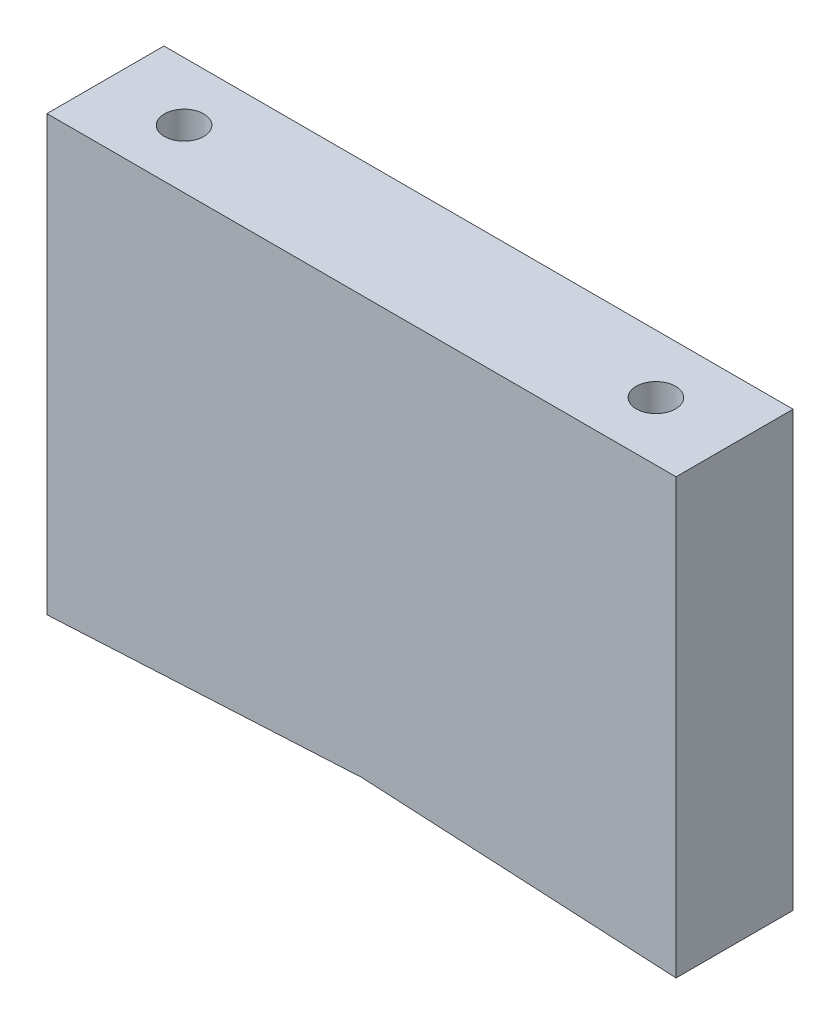
ISO-10303-21;
HEADER;
FILE_DESCRIPTION(('STEP AP214'),'2;1');
FILE_NAME('part.step','',(''),(''),'','','');
FILE_SCHEMA(('AUTOMOTIVE_DESIGN { 1 0 10303 214 1 1 1 1 }'));
ENDSEC;
DATA;
#1=APPLICATION_CONTEXT('core data for automotive mechanical design processes');
#2=APPLICATION_PROTOCOL_DEFINITION('international standard','automotive_design',2000,#1);
#3=PRODUCT_CONTEXT('',#1,'mechanical');
#4=PRODUCT('Part','Part','',(#3));
#5=PRODUCT_RELATED_PRODUCT_CATEGORY('part','',(#4));
#6=PRODUCT_DEFINITION_FORMATION('','',#4);
#7=PRODUCT_DEFINITION_CONTEXT('part definition',#1,'design');
#8=PRODUCT_DEFINITION('design','',#6,#7);
#9=PRODUCT_DEFINITION_SHAPE('','',#8);
#10=(LENGTH_UNIT() NAMED_UNIT(*) SI_UNIT(.MILLI.,.METRE.));
#11=(NAMED_UNIT(*) PLANE_ANGLE_UNIT() SI_UNIT($,.RADIAN.));
#12=(NAMED_UNIT(*) SI_UNIT($,.STERADIAN.) SOLID_ANGLE_UNIT());
#13=UNCERTAINTY_MEASURE_WITH_UNIT(LENGTH_MEASURE(1.E-05),#10,'distance_accuracy_value','');
#14=(GEOMETRIC_REPRESENTATION_CONTEXT(3) GLOBAL_UNCERTAINTY_ASSIGNED_CONTEXT((#13)) GLOBAL_UNIT_ASSIGNED_CONTEXT((#10,
#11,#12)) REPRESENTATION_CONTEXT('',''));
#15=CARTESIAN_POINT('',(0.,0.,0.));
#16=DIRECTION('',(0.,0.,1.));
#17=DIRECTION('',(1.,0.,0.));
#18=AXIS2_PLACEMENT_3D('',#15,#16,#17);
#19=CARTESIAN_POINT('',(40.,-55.2,7.44));
#20=DIRECTION('',(1.,0.,0.));
#21=DIRECTION('',(0.,0.,-1.));
#22=AXIS2_PLACEMENT_3D('',#19,#20,#21);
#23=PLANE('',#22);
#24=DIRECTION('',(0.,0.,-1.));
#25=VECTOR('',#24,1.);
#26=CARTESIAN_POINT('',(40.,0.,7.44));
#27=LINE('',#26,#25);
#28=CARTESIAN_POINT('',(40.,0.,7.44));
#29=VERTEX_POINT('',#28);
#30=CARTESIAN_POINT('',(40.,0.,-7.44));
#31=VERTEX_POINT('',#30);
#32=EDGE_CURVE('E119',#29,#31,#27,.T.);
#33=ORIENTED_EDGE('',*,*,#32,.F.);
#34=DIRECTION('',(0.,1.,0.));
#35=VECTOR('',#34,1.);
#36=CARTESIAN_POINT('',(40.,-55.2,7.44));
#37=LINE('',#36,#35);
#38=CARTESIAN_POINT('',(40.,-55.2,7.44));
#39=VERTEX_POINT('',#38);
#40=EDGE_CURVE('E11',#39,#29,#37,.T.);
#41=ORIENTED_EDGE('',*,*,#40,.F.);
#42=DIRECTION('',(0.,0.,-1.));
#43=VECTOR('',#42,1.);
#44=CARTESIAN_POINT('',(40.,-55.2,7.44));
#45=LINE('',#44,#43);
#46=CARTESIAN_POINT('',(40.,-55.2,-7.44));
#47=VERTEX_POINT('',#46);
#48=EDGE_CURVE('E107',#39,#47,#45,.T.);
#49=ORIENTED_EDGE('',*,*,#48,.T.);
#50=DIRECTION('',(0.,1.,0.));
#51=VECTOR('',#50,1.);
#52=CARTESIAN_POINT('',(40.,-55.2,-7.44));
#53=LINE('',#52,#51);
#54=EDGE_CURVE('E54',#47,#31,#53,.T.);
#55=ORIENTED_EDGE('',*,*,#54,.T.);
#56=EDGE_LOOP('',(#33,#41,#49,#55));
#57=FACE_BOUND('',#56,.T.);
#58=ADVANCED_FACE('F51',(#57),#23,.T.);
#59=CARTESIAN_POINT('',(-40.,-55.2,7.44));
#60=DIRECTION('',(0.,0.,1.));
#61=DIRECTION('',(1.,0.,0.));
#62=AXIS2_PLACEMENT_3D('',#59,#60,#61);
#63=PLANE('',#62);
#64=DIRECTION('',(0.998629534754574,-0.0523359562429371,0.));
#65=VECTOR('',#64,1.);
#66=CARTESIAN_POINT('',(0.,-53.1036888286786,7.44));
#67=LINE('',#66,#65);
#68=CARTESIAN_POINT('',(0.,-53.1036888286786,7.44));
#69=VERTEX_POINT('',#68);
#70=EDGE_CURVE('E122',#69,#39,#67,.T.);
#71=ORIENTED_EDGE('',*,*,#70,.T.);
#72=ORIENTED_EDGE('',*,*,#40,.T.);
#73=DIRECTION('',(1.,0.,0.));
#74=VECTOR('',#73,1.);
#75=CARTESIAN_POINT('',(-40.,0.,7.44));
#76=LINE('',#75,#74);
#77=CARTESIAN_POINT('',(-40.,0.,7.44));
#78=VERTEX_POINT('',#77);
#79=EDGE_CURVE('E99',#78,#29,#76,.T.);
#80=ORIENTED_EDGE('',*,*,#79,.F.);
#81=DIRECTION('',(0.,1.,0.));
#82=VECTOR('',#81,1.);
#83=CARTESIAN_POINT('',(-40.,-55.2,7.44));
#84=LINE('',#83,#82);
#85=CARTESIAN_POINT('',(-40.,-55.2,7.44));
#86=VERTEX_POINT('',#85);
#87=EDGE_CURVE('E60',#86,#78,#84,.T.);
#88=ORIENTED_EDGE('',*,*,#87,.F.);
#89=DIRECTION('',(0.998629534754574,0.0523359562429371,0.));
#90=VECTOR('',#89,1.);
#91=CARTESIAN_POINT('',(-40.,-55.2,7.44));
#92=LINE('',#91,#90);
#93=EDGE_CURVE('E68',#86,#69,#92,.T.);
#94=ORIENTED_EDGE('',*,*,#93,.T.);
#95=EDGE_LOOP('',(#71,#72,#80,#88,#94));
#96=FACE_BOUND('',#95,.T.);
#97=ADVANCED_FACE('F104',(#96),#63,.T.);
#98=CARTESIAN_POINT('',(-40.,-55.2,7.44));
#99=DIRECTION('',(-1.,0.,0.));
#100=DIRECTION('',(0.,0.,1.));
#101=AXIS2_PLACEMENT_3D('',#98,#99,#100);
#102=PLANE('',#101);
#103=DIRECTION('',(0.,0.,1.));
#104=VECTOR('',#103,1.);
#105=CARTESIAN_POINT('',(-40.,0.,7.44));
#106=LINE('',#105,#104);
#107=CARTESIAN_POINT('',(-40.,0.,-7.44));
#108=VERTEX_POINT('',#107);
#109=EDGE_CURVE('E88',#108,#78,#106,.T.);
#110=ORIENTED_EDGE('',*,*,#109,.F.);
#111=DIRECTION('',(0.,1.,0.));
#112=VECTOR('',#111,1.);
#113=CARTESIAN_POINT('',(-40.,-55.2,-7.44));
#114=LINE('',#113,#112);
#115=CARTESIAN_POINT('',(-40.,-55.2,-7.44));
#116=VERTEX_POINT('',#115);
#117=EDGE_CURVE('E93',#116,#108,#114,.T.);
#118=ORIENTED_EDGE('',*,*,#117,.F.);
#119=DIRECTION('',(0.,0.,1.));
#120=VECTOR('',#119,1.);
#121=CARTESIAN_POINT('',(-40.,-55.2,7.44));
#122=LINE('',#121,#120);
#123=EDGE_CURVE('E90',#116,#86,#122,.T.);
#124=ORIENTED_EDGE('',*,*,#123,.T.);
#125=ORIENTED_EDGE('',*,*,#87,.T.);
#126=EDGE_LOOP('',(#110,#118,#124,#125));
#127=FACE_BOUND('',#126,.T.);
#128=ADVANCED_FACE('F86',(#127),#102,.T.);
#129=CARTESIAN_POINT('',(-40.,-55.2,-7.44));
#130=DIRECTION('',(0.,0.,-1.));
#131=DIRECTION('',(-1.,0.,0.));
#132=AXIS2_PLACEMENT_3D('',#129,#130,#131);
#133=PLANE('',#132);
#134=DIRECTION('',(0.998629534754574,-0.0523359562429371,0.));
#135=VECTOR('',#134,1.);
#136=CARTESIAN_POINT('',(0.,-53.1036888286786,-7.44));
#137=LINE('',#136,#135);
#138=CARTESIAN_POINT('',(0.,-53.1036888286786,-7.44));
#139=VERTEX_POINT('',#138);
#140=EDGE_CURVE('E130',#139,#47,#137,.T.);
#141=ORIENTED_EDGE('',*,*,#140,.F.);
#142=DIRECTION('',(0.998629534754574,0.0523359562429371,0.));
#143=VECTOR('',#142,1.);
#144=CARTESIAN_POINT('',(-40.,-55.2,-7.44));
#145=LINE('',#144,#143);
#146=EDGE_CURVE('E132',#116,#139,#145,.T.);
#147=ORIENTED_EDGE('',*,*,#146,.F.);
#148=ORIENTED_EDGE('',*,*,#117,.T.);
#149=DIRECTION('',(-1.,0.,0.));
#150=VECTOR('',#149,1.);
#151=CARTESIAN_POINT('',(-40.,0.,-7.44));
#152=LINE('',#151,#150);
#153=EDGE_CURVE('E101',#31,#108,#152,.T.);
#154=ORIENTED_EDGE('',*,*,#153,.F.);
#155=ORIENTED_EDGE('',*,*,#54,.F.);
#156=EDGE_LOOP('',(#141,#147,#148,#154,#155));
#157=FACE_BOUND('',#156,.T.);
#158=ADVANCED_FACE('F153',(#157),#133,.T.);
#159=CARTESIAN_POINT('',(0.,0.,0.));
#160=DIRECTION('',(0.,-1.,0.));
#161=DIRECTION('',(0.,0.,-1.));
#162=AXIS2_PLACEMENT_3D('',#159,#160,#161);
#163=PLANE('',#162);
#164=CARTESIAN_POINT('',(-30.,0.,0.));
#165=DIRECTION('',(0.,1.,0.));
#166=DIRECTION('',(0.,0.,1.));
#167=AXIS2_PLACEMENT_3D('',#164,#165,#166);
#168=CIRCLE('',#167,2.49999999999999);
#169=CARTESIAN_POINT('',(-30.,0.,2.49999999999999));
#170=VERTEX_POINT('',#169);
#171=EDGE_CURVE('E144',#170,#170,#168,.T.);
#172=ORIENTED_EDGE('',*,*,#171,.F.);
#173=EDGE_LOOP('',(#172));
#174=FACE_BOUND('',#173,.T.);
#175=CARTESIAN_POINT('',(30.,0.,0.));
#176=DIRECTION('',(0.,1.,0.));
#177=DIRECTION('',(0.,0.,1.));
#178=AXIS2_PLACEMENT_3D('',#175,#176,#177);
#179=CIRCLE('',#178,2.49999999999999);
#180=CARTESIAN_POINT('',(30.,0.,2.49999999999998));
#181=VERTEX_POINT('',#180);
#182=EDGE_CURVE('E138',#181,#181,#179,.T.);
#183=ORIENTED_EDGE('',*,*,#182,.F.);
#184=EDGE_LOOP('',(#183));
#185=FACE_BOUND('',#184,.T.);
#186=ORIENTED_EDGE('',*,*,#32,.T.);
#187=ORIENTED_EDGE('',*,*,#153,.T.);
#188=ORIENTED_EDGE('',*,*,#109,.T.);
#189=ORIENTED_EDGE('',*,*,#79,.T.);
#190=EDGE_LOOP('',(#186,#187,#188,#189));
#191=FACE_BOUND('',#190,.T.);
#192=ADVANCED_FACE('F98',(#174,#185,#191),#163,.F.);
#193=CARTESIAN_POINT('',(0.,-53.1036888286786,7.44));
#194=DIRECTION('',(0.0523359562429371,0.998629534754574,0.));
#195=DIRECTION('',(-0.998629534754574,0.0523359562429371,0.));
#196=AXIS2_PLACEMENT_3D('',#193,#194,#195);
#197=PLANE('',#196);
#198=ORIENTED_EDGE('',*,*,#140,.T.);
#199=ORIENTED_EDGE('',*,*,#48,.F.);
#200=ORIENTED_EDGE('',*,*,#70,.F.);
#201=DIRECTION('',(0.,0.,-1.));
#202=VECTOR('',#201,1.);
#203=CARTESIAN_POINT('',(0.,-53.1036888286786,7.44));
#204=LINE('',#203,#202);
#205=EDGE_CURVE('E120',#69,#139,#204,.T.);
#206=ORIENTED_EDGE('',*,*,#205,.T.);
#207=EDGE_LOOP('',(#198,#199,#200,#206));
#208=FACE_BOUND('',#207,.T.);
#209=ADVANCED_FACE('F152',(#208),#197,.F.);
#210=CARTESIAN_POINT('',(-40.,-55.2,7.44));
#211=DIRECTION('',(-0.0523359562429371,0.998629534754574,0.));
#212=DIRECTION('',(-0.998629534754574,-0.0523359562429371,0.));
#213=AXIS2_PLACEMENT_3D('',#210,#211,#212);
#214=PLANE('',#213);
#215=ORIENTED_EDGE('',*,*,#146,.T.);
#216=ORIENTED_EDGE('',*,*,#205,.F.);
#217=ORIENTED_EDGE('',*,*,#93,.F.);
#218=ORIENTED_EDGE('',*,*,#123,.F.);
#219=EDGE_LOOP('',(#215,#216,#217,#218));
#220=FACE_BOUND('',#219,.T.);
#221=ADVANCED_FACE('F170',(#220),#214,.F.);
#222=CARTESIAN_POINT('',(30.,-15.,0.));
#223=DIRECTION('',(0.,1.,0.));
#224=DIRECTION('',(0.,0.,1.));
#225=AXIS2_PLACEMENT_3D('',#222,#223,#224);
#226=CONICAL_SURFACE('',#225,2.49999999999999,1.02974425867665);
#227=CARTESIAN_POINT('',(30.,-16.5021515475689,0.));
#228=VERTEX_POINT('',#227);
#229=VERTEX_LOOP('',#228);
#230=FACE_BOUND('',#229,.T.);
#231=CARTESIAN_POINT('',(30.,-15.,0.));
#232=DIRECTION('',(0.,1.,0.));
#233=DIRECTION('',(0.,0.,1.));
#234=AXIS2_PLACEMENT_3D('',#231,#232,#233);
#235=CIRCLE('',#234,2.49999999999999);
#236=CARTESIAN_POINT('',(30.,-15.,2.49999999999998));
#237=VERTEX_POINT('',#236);
#238=EDGE_CURVE('E133',#237,#237,#235,.T.);
#239=ORIENTED_EDGE('',*,*,#238,.T.);
#240=EDGE_LOOP('',(#239));
#241=FACE_BOUND('',#240,.T.);
#242=ADVANCED_FACE('F160',(#230,#241),#226,.F.);
#243=CARTESIAN_POINT('',(30.,0.,0.));
#244=DIRECTION('',(0.,1.,0.));
#245=DIRECTION('',(0.,0.,1.));
#246=AXIS2_PLACEMENT_3D('',#243,#244,#245);
#247=CYLINDRICAL_SURFACE('',#246,2.49999999999999);
#248=ORIENTED_EDGE('',*,*,#238,.F.);
#249=EDGE_LOOP('',(#248));
#250=FACE_BOUND('',#249,.T.);
#251=ORIENTED_EDGE('',*,*,#182,.T.);
#252=EDGE_LOOP('',(#251));
#253=FACE_BOUND('',#252,.T.);
#254=ADVANCED_FACE('F157',(#250,#253),#247,.F.);
#255=CARTESIAN_POINT('',(-30.,-15.,0.));
#256=DIRECTION('',(0.,1.,0.));
#257=DIRECTION('',(0.,0.,1.));
#258=AXIS2_PLACEMENT_3D('',#255,#256,#257);
#259=CONICAL_SURFACE('',#258,2.49999999999999,1.02974425867665);
#260=CARTESIAN_POINT('',(-30.,-16.5021515475689,0.));
#261=VERTEX_POINT('',#260);
#262=VERTEX_LOOP('',#261);
#263=FACE_BOUND('',#262,.T.);
#264=CARTESIAN_POINT('',(-30.,-15.,0.));
#265=DIRECTION('',(0.,1.,0.));
#266=DIRECTION('',(0.,0.,1.));
#267=AXIS2_PLACEMENT_3D('',#264,#265,#266);
#268=CIRCLE('',#267,2.49999999999999);
#269=CARTESIAN_POINT('',(-30.,-15.,2.49999999999999));
#270=VERTEX_POINT('',#269);
#271=EDGE_CURVE('E141',#270,#270,#268,.T.);
#272=ORIENTED_EDGE('',*,*,#271,.T.);
#273=EDGE_LOOP('',(#272));
#274=FACE_BOUND('',#273,.T.);
#275=ADVANCED_FACE('F159',(#263,#274),#259,.F.);
#276=CARTESIAN_POINT('',(-30.,0.,0.));
#277=DIRECTION('',(0.,1.,0.));
#278=DIRECTION('',(0.,0.,1.));
#279=AXIS2_PLACEMENT_3D('',#276,#277,#278);
#280=CYLINDRICAL_SURFACE('',#279,2.49999999999999);
#281=ORIENTED_EDGE('',*,*,#271,.F.);
#282=EDGE_LOOP('',(#281));
#283=FACE_BOUND('',#282,.T.);
#284=ORIENTED_EDGE('',*,*,#171,.T.);
#285=EDGE_LOOP('',(#284));
#286=FACE_BOUND('',#285,.T.);
#287=ADVANCED_FACE('F148',(#283,#286),#280,.F.);
#288=CLOSED_SHELL('',(#58,#97,#128,#158,#192,#209,#221,#242,#254,#275,#287));
#289=MANIFOLD_SOLID_BREP('B2',#288);
#290=ADVANCED_BREP_SHAPE_REPRESENTATION('',(#18,#289),#14);
#291=SHAPE_DEFINITION_REPRESENTATION(#9,#290);
ENDSEC;
END-ISO-10303-21;
